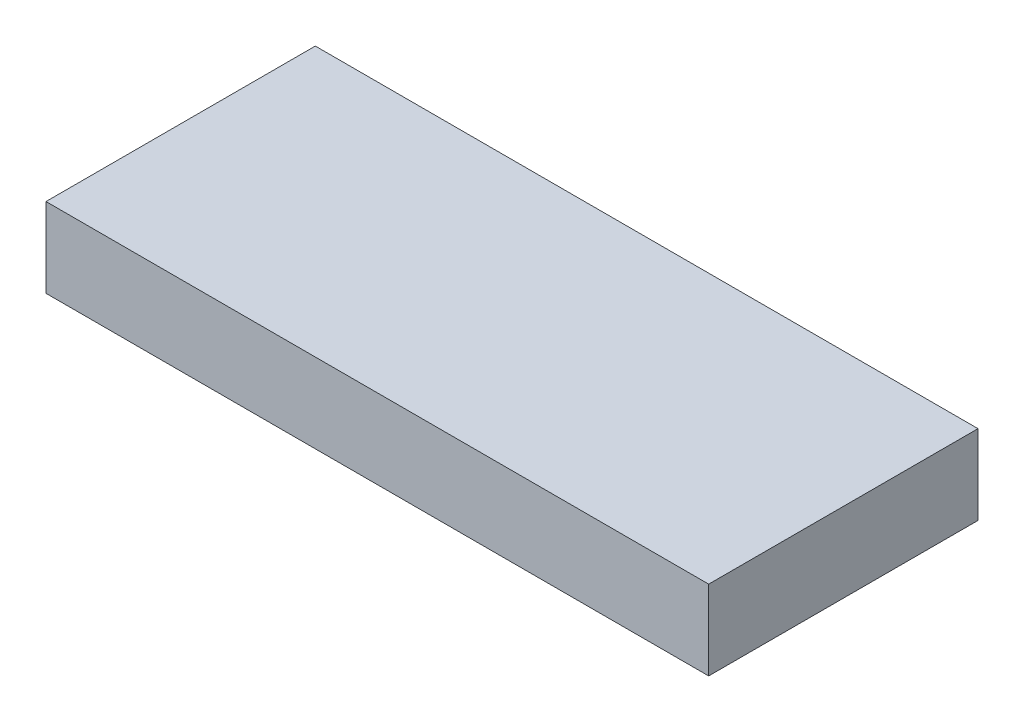
ISO-10303-21;
HEADER;
FILE_DESCRIPTION(('STEP AP214'),'2;1');
FILE_NAME('part.step','',(''),(''),'','','');
FILE_SCHEMA(('AUTOMOTIVE_DESIGN { 1 0 10303 214 1 1 1 1 }'));
ENDSEC;
DATA;
#1=APPLICATION_CONTEXT('core data for automotive mechanical design processes');
#2=APPLICATION_PROTOCOL_DEFINITION('international standard','automotive_design',2000,#1);
#3=PRODUCT_CONTEXT('',#1,'mechanical');
#4=PRODUCT('Part','Part','',(#3));
#5=PRODUCT_RELATED_PRODUCT_CATEGORY('part','',(#4));
#6=PRODUCT_DEFINITION_FORMATION('','',#4);
#7=PRODUCT_DEFINITION_CONTEXT('part definition',#1,'design');
#8=PRODUCT_DEFINITION('design','',#6,#7);
#9=PRODUCT_DEFINITION_SHAPE('','',#8);
#10=(LENGTH_UNIT() NAMED_UNIT(*) SI_UNIT(.MILLI.,.METRE.));
#11=(NAMED_UNIT(*) PLANE_ANGLE_UNIT() SI_UNIT($,.RADIAN.));
#12=(NAMED_UNIT(*) SI_UNIT($,.STERADIAN.) SOLID_ANGLE_UNIT());
#13=UNCERTAINTY_MEASURE_WITH_UNIT(LENGTH_MEASURE(1.E-05),#10,'distance_accuracy_value','');
#14=(GEOMETRIC_REPRESENTATION_CONTEXT(3) GLOBAL_UNCERTAINTY_ASSIGNED_CONTEXT((#13)) GLOBAL_UNIT_ASSIGNED_CONTEXT((#10,
#11,#12)) REPRESENTATION_CONTEXT('',''));
#15=CARTESIAN_POINT('',(0.,0.,0.));
#16=DIRECTION('',(0.,0.,1.));
#17=DIRECTION('',(1.,0.,0.));
#18=AXIS2_PLACEMENT_3D('',#15,#16,#17);
#19=CARTESIAN_POINT('',(31.25,7.5,12.7));
#20=DIRECTION('',(-1.,0.,0.));
#21=DIRECTION('',(0.,0.,1.));
#22=AXIS2_PLACEMENT_3D('',#19,#20,#21);
#23=PLANE('',#22);
#24=DIRECTION('',(0.,0.,-1.));
#25=VECTOR('',#24,1.);
#26=CARTESIAN_POINT('',(31.25,0.,12.7));
#27=LINE('',#26,#25);
#28=CARTESIAN_POINT('',(31.25,0.,12.7));
#29=VERTEX_POINT('',#28);
#30=CARTESIAN_POINT('',(31.25,0.,-12.7));
#31=VERTEX_POINT('',#30);
#32=EDGE_CURVE('E99',#29,#31,#27,.T.);
#33=ORIENTED_EDGE('',*,*,#32,.T.);
#34=DIRECTION('',(0.,-1.,0.));
#35=VECTOR('',#34,1.);
#36=CARTESIAN_POINT('',(31.25,7.5,-12.7));
#37=LINE('',#36,#35);
#38=CARTESIAN_POINT('',(31.25,7.5,-12.7));
#39=VERTEX_POINT('',#38);
#40=EDGE_CURVE('E11',#39,#31,#37,.T.);
#41=ORIENTED_EDGE('',*,*,#40,.F.);
#42=DIRECTION('',(0.,0.,-1.));
#43=VECTOR('',#42,1.);
#44=CARTESIAN_POINT('',(31.25,7.5,12.7));
#45=LINE('',#44,#43);
#46=CARTESIAN_POINT('',(31.25,7.5,12.7));
#47=VERTEX_POINT('',#46);
#48=EDGE_CURVE('E87',#47,#39,#45,.T.);
#49=ORIENTED_EDGE('',*,*,#48,.F.);
#50=DIRECTION('',(0.,-1.,0.));
#51=VECTOR('',#50,1.);
#52=CARTESIAN_POINT('',(31.25,7.5,12.7));
#53=LINE('',#52,#51);
#54=EDGE_CURVE('E95',#47,#29,#53,.T.);
#55=ORIENTED_EDGE('',*,*,#54,.T.);
#56=EDGE_LOOP('',(#33,#41,#49,#55));
#57=FACE_BOUND('',#56,.T.);
#58=ADVANCED_FACE('F36',(#57),#23,.F.);
#59=CARTESIAN_POINT('',(-31.25,7.5,-12.7));
#60=DIRECTION('',(0.,0.,1.));
#61=DIRECTION('',(1.,0.,0.));
#62=AXIS2_PLACEMENT_3D('',#59,#60,#61);
#63=PLANE('',#62);
#64=DIRECTION('',(-1.,0.,0.));
#65=VECTOR('',#64,1.);
#66=CARTESIAN_POINT('',(-31.25,0.,-12.7));
#67=LINE('',#66,#65);
#68=CARTESIAN_POINT('',(-31.25,0.,-12.7));
#69=VERTEX_POINT('',#68);
#70=EDGE_CURVE('E91',#31,#69,#67,.T.);
#71=ORIENTED_EDGE('',*,*,#70,.T.);
#72=DIRECTION('',(0.,-1.,0.));
#73=VECTOR('',#72,1.);
#74=CARTESIAN_POINT('',(-31.25,7.5,-12.7));
#75=LINE('',#74,#73);
#76=CARTESIAN_POINT('',(-31.25,7.5,-12.7));
#77=VERTEX_POINT('',#76);
#78=EDGE_CURVE('E44',#77,#69,#75,.T.);
#79=ORIENTED_EDGE('',*,*,#78,.F.);
#80=DIRECTION('',(-1.,0.,0.));
#81=VECTOR('',#80,1.);
#82=CARTESIAN_POINT('',(-31.25,7.5,-12.7));
#83=LINE('',#82,#81);
#84=EDGE_CURVE('E82',#39,#77,#83,.T.);
#85=ORIENTED_EDGE('',*,*,#84,.F.);
#86=ORIENTED_EDGE('',*,*,#40,.T.);
#87=EDGE_LOOP('',(#71,#79,#85,#86));
#88=FACE_BOUND('',#87,.T.);
#89=ADVANCED_FACE('F90',(#88),#63,.F.);
#90=CARTESIAN_POINT('',(-31.25,7.5,12.7));
#91=DIRECTION('',(1.,0.,0.));
#92=DIRECTION('',(0.,0.,-1.));
#93=AXIS2_PLACEMENT_3D('',#90,#91,#92);
#94=PLANE('',#93);
#95=DIRECTION('',(0.,0.,1.));
#96=VECTOR('',#95,1.);
#97=CARTESIAN_POINT('',(-31.25,0.,12.7));
#98=LINE('',#97,#96);
#99=CARTESIAN_POINT('',(-31.25,0.,12.7));
#100=VERTEX_POINT('',#99);
#101=EDGE_CURVE('E69',#69,#100,#98,.T.);
#102=ORIENTED_EDGE('',*,*,#101,.T.);
#103=DIRECTION('',(0.,-1.,0.));
#104=VECTOR('',#103,1.);
#105=CARTESIAN_POINT('',(-31.25,7.5,12.7));
#106=LINE('',#105,#104);
#107=CARTESIAN_POINT('',(-31.25,7.5,12.7));
#108=VERTEX_POINT('',#107);
#109=EDGE_CURVE('E92',#108,#100,#106,.T.);
#110=ORIENTED_EDGE('',*,*,#109,.F.);
#111=DIRECTION('',(0.,0.,1.));
#112=VECTOR('',#111,1.);
#113=CARTESIAN_POINT('',(-31.25,7.5,12.7));
#114=LINE('',#113,#112);
#115=EDGE_CURVE('E85',#77,#108,#114,.T.);
#116=ORIENTED_EDGE('',*,*,#115,.F.);
#117=ORIENTED_EDGE('',*,*,#78,.T.);
#118=EDGE_LOOP('',(#102,#110,#116,#117));
#119=FACE_BOUND('',#118,.T.);
#120=ADVANCED_FACE('F93',(#119),#94,.F.);
#121=CARTESIAN_POINT('',(-31.25,7.5,12.7));
#122=DIRECTION('',(0.,0.,-1.));
#123=DIRECTION('',(-1.,0.,0.));
#124=AXIS2_PLACEMENT_3D('',#121,#122,#123);
#125=PLANE('',#124);
#126=DIRECTION('',(1.,0.,0.));
#127=VECTOR('',#126,1.);
#128=CARTESIAN_POINT('',(-31.25,0.,12.7));
#129=LINE('',#128,#127);
#130=EDGE_CURVE('E75',#100,#29,#129,.T.);
#131=ORIENTED_EDGE('',*,*,#130,.T.);
#132=ORIENTED_EDGE('',*,*,#54,.F.);
#133=DIRECTION('',(1.,0.,0.));
#134=VECTOR('',#133,1.);
#135=CARTESIAN_POINT('',(-31.25,7.5,12.7));
#136=LINE('',#135,#134);
#137=EDGE_CURVE('E52',#108,#47,#136,.T.);
#138=ORIENTED_EDGE('',*,*,#137,.F.);
#139=ORIENTED_EDGE('',*,*,#109,.T.);
#140=EDGE_LOOP('',(#131,#132,#138,#139));
#141=FACE_BOUND('',#140,.T.);
#142=ADVANCED_FACE('F106',(#141),#125,.F.);
#143=CARTESIAN_POINT('',(0.,7.5,0.));
#144=DIRECTION('',(0.,-1.,0.));
#145=DIRECTION('',(0.,0.,-1.));
#146=AXIS2_PLACEMENT_3D('',#143,#144,#145);
#147=PLANE('',#146);
#148=ORIENTED_EDGE('',*,*,#48,.T.);
#149=ORIENTED_EDGE('',*,*,#84,.T.);
#150=ORIENTED_EDGE('',*,*,#115,.T.);
#151=ORIENTED_EDGE('',*,*,#137,.T.);
#152=EDGE_LOOP('',(#148,#149,#150,#151));
#153=FACE_BOUND('',#152,.T.);
#154=ADVANCED_FACE('F83',(#153),#147,.F.);
#155=CARTESIAN_POINT('',(0.,0.,0.));
#156=DIRECTION('',(0.,-1.,0.));
#157=DIRECTION('',(0.,0.,-1.));
#158=AXIS2_PLACEMENT_3D('',#155,#156,#157);
#159=PLANE('',#158);
#160=ORIENTED_EDGE('',*,*,#32,.F.);
#161=ORIENTED_EDGE('',*,*,#130,.F.);
#162=ORIENTED_EDGE('',*,*,#101,.F.);
#163=ORIENTED_EDGE('',*,*,#70,.F.);
#164=EDGE_LOOP('',(#160,#161,#162,#163));
#165=FACE_BOUND('',#164,.T.);
#166=ADVANCED_FACE('F109',(#165),#159,.T.);
#167=CLOSED_SHELL('',(#58,#89,#120,#142,#154,#166));
#168=MANIFOLD_SOLID_BREP('B2',#167);
#169=ADVANCED_BREP_SHAPE_REPRESENTATION('',(#18,#168),#14);
#170=SHAPE_DEFINITION_REPRESENTATION(#9,#169);
ENDSEC;
END-ISO-10303-21;
